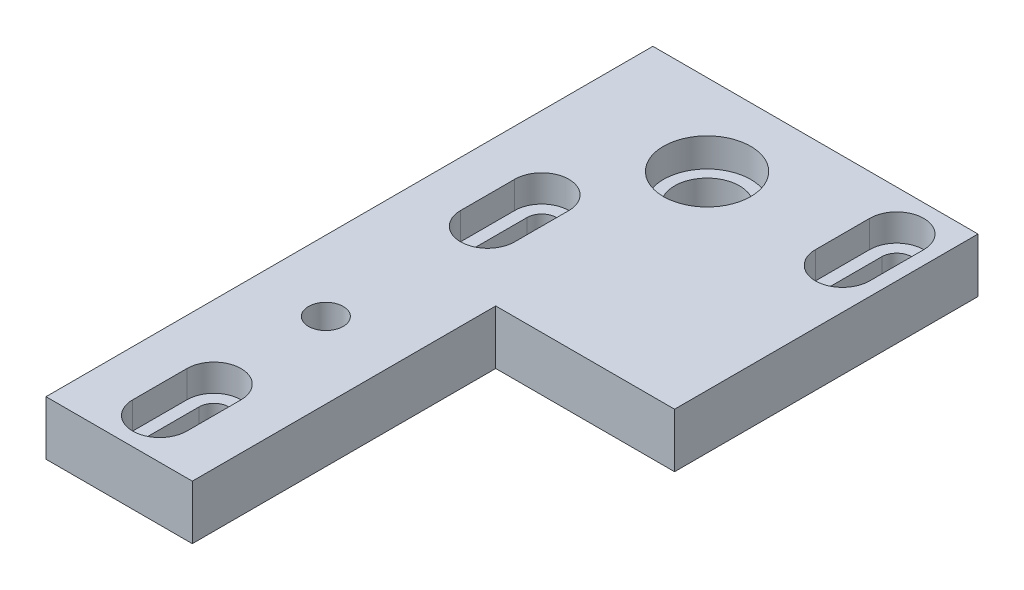
ISO-10303-21;
HEADER;
FILE_DESCRIPTION(('STEP AP214'),'2;1');
FILE_NAME('part.step','',(''),(''),'','','');
FILE_SCHEMA(('AUTOMOTIVE_DESIGN { 1 0 10303 214 1 1 1 1 }'));
ENDSEC;
DATA;
#1=APPLICATION_CONTEXT('core data for automotive mechanical design processes');
#2=APPLICATION_PROTOCOL_DEFINITION('international standard','automotive_design',2000,#1);
#3=PRODUCT_CONTEXT('',#1,'mechanical');
#4=PRODUCT('Part','Part','',(#3));
#5=PRODUCT_RELATED_PRODUCT_CATEGORY('part','',(#4));
#6=PRODUCT_DEFINITION_FORMATION('','',#4);
#7=PRODUCT_DEFINITION_CONTEXT('part definition',#1,'design');
#8=PRODUCT_DEFINITION('design','',#6,#7);
#9=PRODUCT_DEFINITION_SHAPE('','',#8);
#10=(LENGTH_UNIT() NAMED_UNIT(*) SI_UNIT(.MILLI.,.METRE.));
#11=(NAMED_UNIT(*) PLANE_ANGLE_UNIT() SI_UNIT($,.RADIAN.));
#12=(NAMED_UNIT(*) SI_UNIT($,.STERADIAN.) SOLID_ANGLE_UNIT());
#13=UNCERTAINTY_MEASURE_WITH_UNIT(LENGTH_MEASURE(1.E-05),#10,'distance_accuracy_value','');
#14=(GEOMETRIC_REPRESENTATION_CONTEXT(3) GLOBAL_UNCERTAINTY_ASSIGNED_CONTEXT((#13)) GLOBAL_UNIT_ASSIGNED_CONTEXT((#10,
#11,#12)) REPRESENTATION_CONTEXT('',''));
#15=CARTESIAN_POINT('',(0.,0.,0.));
#16=DIRECTION('',(0.,0.,1.));
#17=DIRECTION('',(1.,0.,0.));
#18=AXIS2_PLACEMENT_3D('',#15,#16,#17);
#19=CARTESIAN_POINT('',(0.,10.,0.));
#20=DIRECTION('',(0.,-1.,0.));
#21=DIRECTION('',(0.,0.,-1.));
#22=AXIS2_PLACEMENT_3D('',#19,#20,#21);
#23=PLANE('',#22);
#24=CARTESIAN_POINT('',(-12.,10.,28.35));
#25=DIRECTION('',(0.,1.,0.));
#26=DIRECTION('',(0.,0.,1.));
#27=AXIS2_PLACEMENT_3D('',#24,#25,#26);
#28=CIRCLE('',#27,3.2);
#29=CARTESIAN_POINT('',(-12.,10.,31.55));
#30=VERTEX_POINT('',#29);
#31=EDGE_CURVE('E937',#30,#30,#28,.T.);
#32=ORIENTED_EDGE('',*,*,#31,.F.);
#33=EDGE_LOOP('',(#32));
#34=FACE_BOUND('',#33,.T.);
#35=CARTESIAN_POINT('',(0.,10.,-30.));
#36=DIRECTION('',(0.,1.,0.));
#37=DIRECTION('',(0.,0.,1.));
#38=AXIS2_PLACEMENT_3D('',#35,#36,#37);
#39=CIRCLE('',#38,8.05);
#40=CARTESIAN_POINT('',(0.,10.,-21.95));
#41=VERTEX_POINT('',#40);
#42=EDGE_CURVE('E951',#41,#41,#39,.T.);
#43=ORIENTED_EDGE('',*,*,#42,.F.);
#44=EDGE_LOOP('',(#43));
#45=FACE_BOUND('',#44,.T.);
#46=CARTESIAN_POINT('',(27.5,10.,-27.5));
#47=DIRECTION('',(0.,1.,0.));
#48=DIRECTION('',(0.,0.,1.));
#49=AXIS2_PLACEMENT_3D('',#46,#47,#48);
#50=CIRCLE('',#49,5.);
#51=CARTESIAN_POINT('',(22.5,10.,-27.5));
#52=VERTEX_POINT('',#51);
#53=CARTESIAN_POINT('',(32.5,10.,-27.5));
#54=VERTEX_POINT('',#53);
#55=EDGE_CURVE('E477',#52,#54,#50,.T.);
#56=ORIENTED_EDGE('',*,*,#55,.F.);
#57=DIRECTION('',(0.,0.,-1.));
#58=VECTOR('',#57,1.);
#59=CARTESIAN_POINT('',(22.5,10.,-27.5));
#60=LINE('',#59,#58);
#61=CARTESIAN_POINT('',(22.5,10.,-37.5));
#62=VERTEX_POINT('',#61);
#63=EDGE_CURVE('E498',#52,#62,#60,.T.);
#64=ORIENTED_EDGE('',*,*,#63,.T.);
#65=CARTESIAN_POINT('',(27.5,10.,-37.5));
#66=DIRECTION('',(0.,1.,0.));
#67=DIRECTION('',(0.,0.,1.));
#68=AXIS2_PLACEMENT_3D('',#65,#66,#67);
#69=CIRCLE('',#68,5.);
#70=CARTESIAN_POINT('',(32.5,10.,-37.5));
#71=VERTEX_POINT('',#70);
#72=EDGE_CURVE('E521',#71,#62,#69,.T.);
#73=ORIENTED_EDGE('',*,*,#72,.F.);
#74=DIRECTION('',(0.,0.,-1.));
#75=VECTOR('',#74,1.);
#76=CARTESIAN_POINT('',(32.5,10.,-27.5));
#77=LINE('',#76,#75);
#78=EDGE_CURVE('E485',#54,#71,#77,.T.);
#79=ORIENTED_EDGE('',*,*,#78,.F.);
#80=EDGE_LOOP('',(#56,#64,#73,#79));
#81=FACE_BOUND('',#80,.T.);
#82=DIRECTION('',(0.,0.,-1.));
#83=VECTOR('',#82,1.);
#84=CARTESIAN_POINT('',(35.,10.,-45.));
#85=LINE('',#84,#83);
#86=CARTESIAN_POINT('',(35.,10.,11.));
#87=VERTEX_POINT('',#86);
#88=CARTESIAN_POINT('',(35.,10.,-45.));
#89=VERTEX_POINT('',#88);
#90=EDGE_CURVE('E711',#87,#89,#85,.T.);
#91=ORIENTED_EDGE('',*,*,#90,.T.);
#92=DIRECTION('',(-1.,0.,0.));
#93=VECTOR('',#92,1.);
#94=CARTESIAN_POINT('',(-25.,10.,-45.));
#95=LINE('',#94,#93);
#96=CARTESIAN_POINT('',(-25.,10.,-45.));
#97=VERTEX_POINT('',#96);
#98=EDGE_CURVE('E715',#89,#97,#95,.T.);
#99=ORIENTED_EDGE('',*,*,#98,.T.);
#100=DIRECTION('',(0.,0.,1.));
#101=VECTOR('',#100,1.);
#102=CARTESIAN_POINT('',(-25.,10.,-45.));
#103=LINE('',#102,#101);
#104=CARTESIAN_POINT('',(-25.,10.,67.));
#105=VERTEX_POINT('',#104);
#106=EDGE_CURVE('E719',#97,#105,#103,.T.);
#107=ORIENTED_EDGE('',*,*,#106,.T.);
#108=DIRECTION('',(1.,0.,0.));
#109=VECTOR('',#108,1.);
#110=CARTESIAN_POINT('',(-25.,10.,67.));
#111=LINE('',#110,#109);
#112=CARTESIAN_POINT('',(2.00000000000002,10.,67.));
#113=VERTEX_POINT('',#112);
#114=EDGE_CURVE('E722',#105,#113,#111,.T.);
#115=ORIENTED_EDGE('',*,*,#114,.T.);
#116=DIRECTION('',(0.,0.,-1.));
#117=VECTOR('',#116,1.);
#118=CARTESIAN_POINT('',(2.00000000000002,10.,11.));
#119=LINE('',#118,#117);
#120=CARTESIAN_POINT('',(2.00000000000002,10.,11.));
#121=VERTEX_POINT('',#120);
#122=EDGE_CURVE('E725',#113,#121,#119,.T.);
#123=ORIENTED_EDGE('',*,*,#122,.T.);
#124=DIRECTION('',(1.,0.,0.));
#125=VECTOR('',#124,1.);
#126=CARTESIAN_POINT('',(35.,10.,11.));
#127=LINE('',#126,#125);
#128=EDGE_CURVE('E728',#121,#87,#127,.T.);
#129=ORIENTED_EDGE('',*,*,#128,.T.);
#130=EDGE_LOOP('',(#91,#99,#107,#115,#123,#129));
#131=FACE_BOUND('',#130,.T.);
#132=CARTESIAN_POINT('',(-11.5,10.,59.5));
#133=DIRECTION('',(0.,1.,0.));
#134=DIRECTION('',(0.,0.,1.));
#135=AXIS2_PLACEMENT_3D('',#132,#133,#134);
#136=CIRCLE('',#135,5.);
#137=CARTESIAN_POINT('',(-16.5,10.,59.5));
#138=VERTEX_POINT('',#137);
#139=CARTESIAN_POINT('',(-6.49999999999998,10.,59.5));
#140=VERTEX_POINT('',#139);
#141=EDGE_CURVE('E662',#138,#140,#136,.T.);
#142=ORIENTED_EDGE('',*,*,#141,.F.);
#143=DIRECTION('',(0.,0.,-1.));
#144=VECTOR('',#143,1.);
#145=CARTESIAN_POINT('',(-16.5,10.,59.5));
#146=LINE('',#145,#144);
#147=CARTESIAN_POINT('',(-16.5,10.,49.5));
#148=VERTEX_POINT('',#147);
#149=EDGE_CURVE('E646',#138,#148,#146,.T.);
#150=ORIENTED_EDGE('',*,*,#149,.T.);
#151=CARTESIAN_POINT('',(-11.5,10.,49.5));
#152=DIRECTION('',(0.,1.,0.));
#153=DIRECTION('',(0.,0.,1.));
#154=AXIS2_PLACEMENT_3D('',#151,#152,#153);
#155=CIRCLE('',#154,5.);
#156=CARTESIAN_POINT('',(-6.49999999999999,10.,49.5));
#157=VERTEX_POINT('',#156);
#158=EDGE_CURVE('E691',#157,#148,#155,.T.);
#159=ORIENTED_EDGE('',*,*,#158,.F.);
#160=DIRECTION('',(0.,0.,-1.));
#161=VECTOR('',#160,1.);
#162=CARTESIAN_POINT('',(-6.49999999999999,10.,59.5));
#163=LINE('',#162,#161);
#164=EDGE_CURVE('E624',#140,#157,#163,.T.);
#165=ORIENTED_EDGE('',*,*,#164,.F.);
#166=EDGE_LOOP('',(#142,#150,#159,#165));
#167=FACE_BOUND('',#166,.T.);
#168=DIRECTION('',(0.,0.,-1.));
#169=VECTOR('',#168,1.);
#170=CARTESIAN_POINT('',(-6.49999999999999,10.,-1.));
#171=LINE('',#170,#169);
#172=CARTESIAN_POINT('',(-6.49999999999998,10.,-1.));
#173=VERTEX_POINT('',#172);
#174=CARTESIAN_POINT('',(-6.49999999999999,10.,-11.));
#175=VERTEX_POINT('',#174);
#176=EDGE_CURVE('E539',#173,#175,#171,.T.);
#177=ORIENTED_EDGE('',*,*,#176,.F.);
#178=CARTESIAN_POINT('',(-11.5,10.,-1.));
#179=DIRECTION('',(0.,1.,0.));
#180=DIRECTION('',(0.,0.,1.));
#181=AXIS2_PLACEMENT_3D('',#178,#179,#180);
#182=CIRCLE('',#181,5.);
#183=CARTESIAN_POINT('',(-16.5,10.,-1.));
#184=VERTEX_POINT('',#183);
#185=EDGE_CURVE('E577',#184,#173,#182,.T.);
#186=ORIENTED_EDGE('',*,*,#185,.F.);
#187=DIRECTION('',(0.,0.,-1.));
#188=VECTOR('',#187,1.);
#189=CARTESIAN_POINT('',(-16.5,10.,-1.));
#190=LINE('',#189,#188);
#191=CARTESIAN_POINT('',(-16.5,10.,-11.));
#192=VERTEX_POINT('',#191);
#193=EDGE_CURVE('E561',#184,#192,#190,.T.);
#194=ORIENTED_EDGE('',*,*,#193,.T.);
#195=CARTESIAN_POINT('',(-11.5,10.,-11.));
#196=DIRECTION('',(0.,1.,0.));
#197=DIRECTION('',(0.,0.,1.));
#198=AXIS2_PLACEMENT_3D('',#195,#196,#197);
#199=CIRCLE('',#198,5.);
#200=EDGE_CURVE('E605',#175,#192,#199,.T.);
#201=ORIENTED_EDGE('',*,*,#200,.F.);
#202=EDGE_LOOP('',(#177,#186,#194,#201));
#203=FACE_BOUND('',#202,.T.);
#204=ADVANCED_FACE('F267',(#34,#45,#81,#131,#167,#203),#23,.F.);
#205=CARTESIAN_POINT('',(0.,0.,0.));
#206=DIRECTION('',(0.,-1.,0.));
#207=DIRECTION('',(0.,0.,-1.));
#208=AXIS2_PLACEMENT_3D('',#205,#206,#207);
#209=PLANE('',#208);
#210=CARTESIAN_POINT('',(-12.,0.,28.35));
#211=DIRECTION('',(0.,1.,0.));
#212=DIRECTION('',(0.,0.,1.));
#213=AXIS2_PLACEMENT_3D('',#210,#211,#212);
#214=CIRCLE('',#213,3.2);
#215=CARTESIAN_POINT('',(-12.,0.,31.55));
#216=VERTEX_POINT('',#215);
#217=EDGE_CURVE('E935',#216,#216,#214,.T.);
#218=ORIENTED_EDGE('',*,*,#217,.T.);
#219=EDGE_LOOP('',(#218));
#220=FACE_BOUND('',#219,.T.);
#221=CARTESIAN_POINT('',(0.,0.,-30.));
#222=DIRECTION('',(0.,1.,0.));
#223=DIRECTION('',(0.,0.,1.));
#224=AXIS2_PLACEMENT_3D('',#221,#222,#223);
#225=CIRCLE('',#224,6.);
#226=CARTESIAN_POINT('',(0.,0.,-24.));
#227=VERTEX_POINT('',#226);
#228=EDGE_CURVE('E944',#227,#227,#225,.T.);
#229=ORIENTED_EDGE('',*,*,#228,.T.);
#230=EDGE_LOOP('',(#229));
#231=FACE_BOUND('',#230,.T.);
#232=DIRECTION('',(0.,0.,-1.));
#233=VECTOR('',#232,1.);
#234=CARTESIAN_POINT('',(24.75,0.,-27.5));
#235=LINE('',#234,#233);
#236=CARTESIAN_POINT('',(24.75,0.,-27.5));
#237=VERTEX_POINT('',#236);
#238=CARTESIAN_POINT('',(24.75,0.,-37.5));
#239=VERTEX_POINT('',#238);
#240=EDGE_CURVE('E967',#237,#239,#235,.T.);
#241=ORIENTED_EDGE('',*,*,#240,.F.);
#242=CARTESIAN_POINT('',(27.5,0.,-27.5));
#243=DIRECTION('',(0.,1.,0.));
#244=DIRECTION('',(0.,0.,1.));
#245=AXIS2_PLACEMENT_3D('',#242,#243,#244);
#246=CIRCLE('',#245,2.75);
#247=CARTESIAN_POINT('',(30.25,0.,-27.5));
#248=VERTEX_POINT('',#247);
#249=EDGE_CURVE('E506',#237,#248,#246,.T.);
#250=ORIENTED_EDGE('',*,*,#249,.T.);
#251=DIRECTION('',(0.,0.,-1.));
#252=VECTOR('',#251,1.);
#253=CARTESIAN_POINT('',(30.25,0.,-27.5));
#254=LINE('',#253,#252);
#255=CARTESIAN_POINT('',(30.25,0.,-37.5));
#256=VERTEX_POINT('',#255);
#257=EDGE_CURVE('E963',#248,#256,#254,.T.);
#258=ORIENTED_EDGE('',*,*,#257,.T.);
#259=CARTESIAN_POINT('',(27.5,0.,-37.5));
#260=DIRECTION('',(0.,1.,0.));
#261=DIRECTION('',(0.,0.,1.));
#262=AXIS2_PLACEMENT_3D('',#259,#260,#261);
#263=CIRCLE('',#262,2.75);
#264=EDGE_CURVE('E532',#256,#239,#263,.T.);
#265=ORIENTED_EDGE('',*,*,#264,.T.);
#266=EDGE_LOOP('',(#241,#250,#258,#265));
#267=FACE_BOUND('',#266,.T.);
#268=CARTESIAN_POINT('',(-11.5,0.,49.5));
#269=DIRECTION('',(0.,1.,0.));
#270=DIRECTION('',(0.,0.,1.));
#271=AXIS2_PLACEMENT_3D('',#268,#269,#270);
#272=CIRCLE('',#271,2.75);
#273=CARTESIAN_POINT('',(-8.74999999999999,0.,49.5));
#274=VERTEX_POINT('',#273);
#275=CARTESIAN_POINT('',(-14.25,0.,49.5));
#276=VERTEX_POINT('',#275);
#277=EDGE_CURVE('E703',#274,#276,#272,.T.);
#278=ORIENTED_EDGE('',*,*,#277,.T.);
#279=DIRECTION('',(0.,0.,-1.));
#280=VECTOR('',#279,1.);
#281=CARTESIAN_POINT('',(-14.25,0.,59.5));
#282=LINE('',#281,#280);
#283=CARTESIAN_POINT('',(-14.25,0.,59.5));
#284=VERTEX_POINT('',#283);
#285=EDGE_CURVE('E637',#284,#276,#282,.T.);
#286=ORIENTED_EDGE('',*,*,#285,.F.);
#287=CARTESIAN_POINT('',(-11.5,0.,59.5));
#288=DIRECTION('',(0.,1.,0.));
#289=DIRECTION('',(0.,0.,1.));
#290=AXIS2_PLACEMENT_3D('',#287,#288,#289);
#291=CIRCLE('',#290,2.75);
#292=CARTESIAN_POINT('',(-8.74999999999998,0.,59.5));
#293=VERTEX_POINT('',#292);
#294=EDGE_CURVE('E672',#284,#293,#291,.T.);
#295=ORIENTED_EDGE('',*,*,#294,.T.);
#296=DIRECTION('',(0.,0.,-1.));
#297=VECTOR('',#296,1.);
#298=CARTESIAN_POINT('',(-8.74999999999998,0.,59.5));
#299=LINE('',#298,#297);
#300=EDGE_CURVE('E633',#293,#274,#299,.T.);
#301=ORIENTED_EDGE('',*,*,#300,.T.);
#302=EDGE_LOOP('',(#278,#286,#295,#301));
#303=FACE_BOUND('',#302,.T.);
#304=DIRECTION('',(0.,0.,-1.));
#305=VECTOR('',#304,1.);
#306=CARTESIAN_POINT('',(35.,0.,-45.));
#307=LINE('',#306,#305);
#308=CARTESIAN_POINT('',(35.,0.,11.));
#309=VERTEX_POINT('',#308);
#310=CARTESIAN_POINT('',(35.,0.,-45.));
#311=VERTEX_POINT('',#310);
#312=EDGE_CURVE('E710',#309,#311,#307,.T.);
#313=ORIENTED_EDGE('',*,*,#312,.F.);
#314=DIRECTION('',(1.,0.,0.));
#315=VECTOR('',#314,1.);
#316=CARTESIAN_POINT('',(35.,0.,11.));
#317=LINE('',#316,#315);
#318=CARTESIAN_POINT('',(2.00000000000002,0.,11.));
#319=VERTEX_POINT('',#318);
#320=EDGE_CURVE('E716',#319,#309,#317,.T.);
#321=ORIENTED_EDGE('',*,*,#320,.F.);
#322=DIRECTION('',(0.,0.,-1.));
#323=VECTOR('',#322,1.);
#324=CARTESIAN_POINT('',(2.00000000000002,0.,11.));
#325=LINE('',#324,#323);
#326=CARTESIAN_POINT('',(2.00000000000002,0.,67.));
#327=VERTEX_POINT('',#326);
#328=EDGE_CURVE('E744',#327,#319,#325,.T.);
#329=ORIENTED_EDGE('',*,*,#328,.F.);
#330=DIRECTION('',(1.,0.,0.));
#331=VECTOR('',#330,1.);
#332=CARTESIAN_POINT('',(-25.,0.,67.));
#333=LINE('',#332,#331);
#334=CARTESIAN_POINT('',(-25.,0.,67.));
#335=VERTEX_POINT('',#334);
#336=EDGE_CURVE('E741',#335,#327,#333,.T.);
#337=ORIENTED_EDGE('',*,*,#336,.F.);
#338=DIRECTION('',(0.,0.,1.));
#339=VECTOR('',#338,1.);
#340=CARTESIAN_POINT('',(-25.,0.,-45.));
#341=LINE('',#340,#339);
#342=CARTESIAN_POINT('',(-25.,0.,-45.));
#343=VERTEX_POINT('',#342);
#344=EDGE_CURVE('E738',#343,#335,#341,.T.);
#345=ORIENTED_EDGE('',*,*,#344,.F.);
#346=DIRECTION('',(-1.,0.,0.));
#347=VECTOR('',#346,1.);
#348=CARTESIAN_POINT('',(-25.,0.,-45.));
#349=LINE('',#348,#347);
#350=EDGE_CURVE('E735',#311,#343,#349,.T.);
#351=ORIENTED_EDGE('',*,*,#350,.F.);
#352=EDGE_LOOP('',(#313,#321,#329,#337,#345,#351));
#353=FACE_BOUND('',#352,.T.);
#354=CARTESIAN_POINT('',(-11.5,0.,-1.));
#355=DIRECTION('',(0.,1.,0.));
#356=DIRECTION('',(0.,0.,1.));
#357=AXIS2_PLACEMENT_3D('',#354,#355,#356);
#358=CIRCLE('',#357,2.75);
#359=CARTESIAN_POINT('',(-14.25,0.,-1.));
#360=VERTEX_POINT('',#359);
#361=CARTESIAN_POINT('',(-8.74999999999998,0.,-1.));
#362=VERTEX_POINT('',#361);
#363=EDGE_CURVE('E586',#360,#362,#358,.T.);
#364=ORIENTED_EDGE('',*,*,#363,.T.);
#365=DIRECTION('',(0.,0.,-1.));
#366=VECTOR('',#365,1.);
#367=CARTESIAN_POINT('',(-8.74999999999998,0.,-1.));
#368=LINE('',#367,#366);
#369=CARTESIAN_POINT('',(-8.74999999999999,0.,-11.));
#370=VERTEX_POINT('',#369);
#371=EDGE_CURVE('E548',#362,#370,#368,.T.);
#372=ORIENTED_EDGE('',*,*,#371,.T.);
#373=CARTESIAN_POINT('',(-11.5,0.,-11.));
#374=DIRECTION('',(0.,1.,0.));
#375=DIRECTION('',(0.,0.,1.));
#376=AXIS2_PLACEMENT_3D('',#373,#374,#375);
#377=CIRCLE('',#376,2.75);
#378=CARTESIAN_POINT('',(-14.25,0.,-11.));
#379=VERTEX_POINT('',#378);
#380=EDGE_CURVE('E616',#370,#379,#377,.T.);
#381=ORIENTED_EDGE('',*,*,#380,.T.);
#382=DIRECTION('',(0.,0.,-1.));
#383=VECTOR('',#382,1.);
#384=CARTESIAN_POINT('',(-14.25,0.,-1.));
#385=LINE('',#384,#383);
#386=EDGE_CURVE('E552',#360,#379,#385,.T.);
#387=ORIENTED_EDGE('',*,*,#386,.F.);
#388=EDGE_LOOP('',(#364,#372,#381,#387));
#389=FACE_BOUND('',#388,.T.);
#390=ADVANCED_FACE('F775',(#220,#231,#267,#303,#353,#389),#209,.T.);
#391=CARTESIAN_POINT('',(35.,10.,-45.));
#392=DIRECTION('',(-1.,0.,0.));
#393=DIRECTION('',(0.,0.,1.));
#394=AXIS2_PLACEMENT_3D('',#391,#392,#393);
#395=PLANE('',#394);
#396=ORIENTED_EDGE('',*,*,#312,.T.);
#397=DIRECTION('',(0.,-1.,0.));
#398=VECTOR('',#397,1.);
#399=CARTESIAN_POINT('',(35.,10.,-45.));
#400=LINE('',#399,#398);
#401=EDGE_CURVE('E13',#89,#311,#400,.T.);
#402=ORIENTED_EDGE('',*,*,#401,.F.);
#403=ORIENTED_EDGE('',*,*,#90,.F.);
#404=DIRECTION('',(0.,-1.,0.));
#405=VECTOR('',#404,1.);
#406=CARTESIAN_POINT('',(35.,10.,11.));
#407=LINE('',#406,#405);
#408=EDGE_CURVE('E731',#87,#309,#407,.T.);
#409=ORIENTED_EDGE('',*,*,#408,.T.);
#410=EDGE_LOOP('',(#396,#402,#403,#409));
#411=FACE_BOUND('',#410,.T.);
#412=ADVANCED_FACE('F269',(#411),#395,.F.);
#413=CARTESIAN_POINT('',(-25.,10.,-45.));
#414=DIRECTION('',(0.,0.,1.));
#415=DIRECTION('',(1.,0.,0.));
#416=AXIS2_PLACEMENT_3D('',#413,#414,#415);
#417=PLANE('',#416);
#418=ORIENTED_EDGE('',*,*,#350,.T.);
#419=DIRECTION('',(0.,-1.,0.));
#420=VECTOR('',#419,1.);
#421=CARTESIAN_POINT('',(-25.,10.,-45.));
#422=LINE('',#421,#420);
#423=EDGE_CURVE('E276',#97,#343,#422,.T.);
#424=ORIENTED_EDGE('',*,*,#423,.F.);
#425=ORIENTED_EDGE('',*,*,#98,.F.);
#426=ORIENTED_EDGE('',*,*,#401,.T.);
#427=EDGE_LOOP('',(#418,#424,#425,#426));
#428=FACE_BOUND('',#427,.T.);
#429=ADVANCED_FACE('F793',(#428),#417,.F.);
#430=CARTESIAN_POINT('',(-25.,10.,-45.));
#431=DIRECTION('',(1.,0.,0.));
#432=DIRECTION('',(0.,0.,-1.));
#433=AXIS2_PLACEMENT_3D('',#430,#431,#432);
#434=PLANE('',#433);
#435=ORIENTED_EDGE('',*,*,#344,.T.);
#436=DIRECTION('',(0.,-1.,0.));
#437=VECTOR('',#436,1.);
#438=CARTESIAN_POINT('',(-25.,10.,67.));
#439=LINE('',#438,#437);
#440=EDGE_CURVE('E760',#105,#335,#439,.T.);
#441=ORIENTED_EDGE('',*,*,#440,.F.);
#442=ORIENTED_EDGE('',*,*,#106,.F.);
#443=ORIENTED_EDGE('',*,*,#423,.T.);
#444=EDGE_LOOP('',(#435,#441,#442,#443));
#445=FACE_BOUND('',#444,.T.);
#446=ADVANCED_FACE('F769',(#445),#434,.F.);
#447=CARTESIAN_POINT('',(-25.,10.,67.));
#448=DIRECTION('',(0.,0.,-1.));
#449=DIRECTION('',(-1.,0.,0.));
#450=AXIS2_PLACEMENT_3D('',#447,#448,#449);
#451=PLANE('',#450);
#452=ORIENTED_EDGE('',*,*,#336,.T.);
#453=DIRECTION('',(0.,-1.,0.));
#454=VECTOR('',#453,1.);
#455=CARTESIAN_POINT('',(2.00000000000002,10.,67.));
#456=LINE('',#455,#454);
#457=EDGE_CURVE('E756',#113,#327,#456,.T.);
#458=ORIENTED_EDGE('',*,*,#457,.F.);
#459=ORIENTED_EDGE('',*,*,#114,.F.);
#460=ORIENTED_EDGE('',*,*,#440,.T.);
#461=EDGE_LOOP('',(#452,#458,#459,#460));
#462=FACE_BOUND('',#461,.T.);
#463=ADVANCED_FACE('F781',(#462),#451,.F.);
#464=CARTESIAN_POINT('',(2.00000000000002,10.,11.));
#465=DIRECTION('',(-1.,0.,0.));
#466=DIRECTION('',(0.,0.,1.));
#467=AXIS2_PLACEMENT_3D('',#464,#465,#466);
#468=PLANE('',#467);
#469=ORIENTED_EDGE('',*,*,#328,.T.);
#470=DIRECTION('',(0.,-1.,0.));
#471=VECTOR('',#470,1.);
#472=CARTESIAN_POINT('',(2.00000000000002,10.,11.));
#473=LINE('',#472,#471);
#474=EDGE_CURVE('E752',#121,#319,#473,.T.);
#475=ORIENTED_EDGE('',*,*,#474,.F.);
#476=ORIENTED_EDGE('',*,*,#122,.F.);
#477=ORIENTED_EDGE('',*,*,#457,.T.);
#478=EDGE_LOOP('',(#469,#475,#476,#477));
#479=FACE_BOUND('',#478,.T.);
#480=ADVANCED_FACE('F785',(#479),#468,.F.);
#481=CARTESIAN_POINT('',(35.,10.,11.));
#482=DIRECTION('',(0.,0.,-1.));
#483=DIRECTION('',(-1.,0.,0.));
#484=AXIS2_PLACEMENT_3D('',#481,#482,#483);
#485=PLANE('',#484);
#486=ORIENTED_EDGE('',*,*,#320,.T.);
#487=ORIENTED_EDGE('',*,*,#408,.F.);
#488=ORIENTED_EDGE('',*,*,#128,.F.);
#489=ORIENTED_EDGE('',*,*,#474,.T.);
#490=EDGE_LOOP('',(#486,#487,#488,#489));
#491=FACE_BOUND('',#490,.T.);
#492=ADVANCED_FACE('F796',(#491),#485,.F.);
#493=CARTESIAN_POINT('',(-11.5,10.,49.5));
#494=DIRECTION('',(0.,1.,0.));
#495=DIRECTION('',(0.,0.,1.));
#496=AXIS2_PLACEMENT_3D('',#493,#494,#495);
#497=CYLINDRICAL_SURFACE('',#496,2.75);
#498=ORIENTED_EDGE('',*,*,#277,.F.);
#499=DIRECTION('',(0.,-1.,0.));
#500=VECTOR('',#499,1.);
#501=CARTESIAN_POINT('',(-8.74999999999999,0.,49.5));
#502=LINE('',#501,#500);
#503=CARTESIAN_POINT('',(-8.74999999999998,5.,49.5));
#504=VERTEX_POINT('',#503);
#505=EDGE_CURVE('E687',#504,#274,#502,.T.);
#506=ORIENTED_EDGE('',*,*,#505,.F.);
#507=CARTESIAN_POINT('',(-11.5,5.,49.5));
#508=DIRECTION('',(0.,1.,0.));
#509=DIRECTION('',(0.,0.,1.));
#510=AXIS2_PLACEMENT_3D('',#507,#508,#509);
#511=CIRCLE('',#510,2.75);
#512=CARTESIAN_POINT('',(-14.25,5.,49.5));
#513=VERTEX_POINT('',#512);
#514=EDGE_CURVE('E699',#504,#513,#511,.T.);
#515=ORIENTED_EDGE('',*,*,#514,.T.);
#516=DIRECTION('',(0.,1.,0.));
#517=VECTOR('',#516,1.);
#518=CARTESIAN_POINT('',(-14.25,10.,49.5));
#519=LINE('',#518,#517);
#520=EDGE_CURVE('E679',#276,#513,#519,.T.);
#521=ORIENTED_EDGE('',*,*,#520,.F.);
#522=EDGE_LOOP('',(#498,#506,#515,#521));
#523=FACE_BOUND('',#522,.T.);
#524=ADVANCED_FACE('F798',(#523),#497,.F.);
#525=CARTESIAN_POINT('',(-8.74999999999998,5.,49.5));
#526=DIRECTION('',(0.,-1.,0.));
#527=DIRECTION('',(0.,0.,-1.));
#528=AXIS2_PLACEMENT_3D('',#525,#526,#527);
#529=PLANE('',#528);
#530=DIRECTION('',(0.,0.,-1.));
#531=VECTOR('',#530,1.);
#532=CARTESIAN_POINT('',(-16.5,5.,59.5));
#533=LINE('',#532,#531);
#534=CARTESIAN_POINT('',(-16.5,5.,59.5));
#535=VERTEX_POINT('',#534);
#536=CARTESIAN_POINT('',(-16.5,5.,49.5));
#537=VERTEX_POINT('',#536);
#538=EDGE_CURVE('E643',#535,#537,#533,.T.);
#539=ORIENTED_EDGE('',*,*,#538,.F.);
#540=CARTESIAN_POINT('',(-11.5,5.,59.5));
#541=DIRECTION('',(0.,1.,0.));
#542=DIRECTION('',(0.,0.,1.));
#543=AXIS2_PLACEMENT_3D('',#540,#541,#542);
#544=CIRCLE('',#543,5.);
#545=CARTESIAN_POINT('',(-6.49999999999998,5.,59.5));
#546=VERTEX_POINT('',#545);
#547=EDGE_CURVE('E666',#535,#546,#544,.T.);
#548=ORIENTED_EDGE('',*,*,#547,.T.);
#549=DIRECTION('',(0.,0.,-1.));
#550=VECTOR('',#549,1.);
#551=CARTESIAN_POINT('',(-6.49999999999998,5.,59.5));
#552=LINE('',#551,#550);
#553=CARTESIAN_POINT('',(-6.49999999999998,5.,49.5));
#554=VERTEX_POINT('',#553);
#555=EDGE_CURVE('E627',#546,#554,#552,.T.);
#556=ORIENTED_EDGE('',*,*,#555,.T.);
#557=CARTESIAN_POINT('',(-11.5,5.,49.5));
#558=DIRECTION('',(0.,1.,0.));
#559=DIRECTION('',(0.,0.,1.));
#560=AXIS2_PLACEMENT_3D('',#557,#558,#559);
#561=CIRCLE('',#560,5.);
#562=EDGE_CURVE('E695',#554,#537,#561,.T.);
#563=ORIENTED_EDGE('',*,*,#562,.T.);
#564=EDGE_LOOP('',(#539,#548,#556,#563));
#565=FACE_BOUND('',#564,.T.);
#566=ORIENTED_EDGE('',*,*,#514,.F.);
#567=DIRECTION('',(0.,0.,-1.));
#568=VECTOR('',#567,1.);
#569=CARTESIAN_POINT('',(-8.74999999999998,5.,59.5));
#570=LINE('',#569,#568);
#571=CARTESIAN_POINT('',(-8.74999999999998,5.,59.5));
#572=VERTEX_POINT('',#571);
#573=EDGE_CURVE('E630',#572,#504,#570,.T.);
#574=ORIENTED_EDGE('',*,*,#573,.F.);
#575=CARTESIAN_POINT('',(-11.5,5.,59.5));
#576=DIRECTION('',(0.,1.,0.));
#577=DIRECTION('',(0.,0.,1.));
#578=AXIS2_PLACEMENT_3D('',#575,#576,#577);
#579=CIRCLE('',#578,2.75);
#580=CARTESIAN_POINT('',(-14.25,5.,59.5));
#581=VERTEX_POINT('',#580);
#582=EDGE_CURVE('E669',#581,#572,#579,.T.);
#583=ORIENTED_EDGE('',*,*,#582,.F.);
#584=DIRECTION('',(0.,0.,-1.));
#585=VECTOR('',#584,1.);
#586=CARTESIAN_POINT('',(-14.25,5.,59.5));
#587=LINE('',#586,#585);
#588=EDGE_CURVE('E640',#581,#513,#587,.T.);
#589=ORIENTED_EDGE('',*,*,#588,.T.);
#590=EDGE_LOOP('',(#566,#574,#583,#589));
#591=FACE_BOUND('',#590,.T.);
#592=ADVANCED_FACE('F804',(#565,#591),#529,.F.);
#593=CARTESIAN_POINT('',(-11.5,10.,49.5));
#594=DIRECTION('',(0.,1.,0.));
#595=DIRECTION('',(0.,0.,1.));
#596=AXIS2_PLACEMENT_3D('',#593,#594,#595);
#597=CYLINDRICAL_SURFACE('',#596,5.);
#598=ORIENTED_EDGE('',*,*,#562,.F.);
#599=DIRECTION('',(0.,-1.,0.));
#600=VECTOR('',#599,1.);
#601=CARTESIAN_POINT('',(-6.49999999999998,5.,49.5));
#602=LINE('',#601,#600);
#603=EDGE_CURVE('E683',#157,#554,#602,.T.);
#604=ORIENTED_EDGE('',*,*,#603,.F.);
#605=ORIENTED_EDGE('',*,*,#158,.T.);
#606=DIRECTION('',(0.,1.,0.));
#607=VECTOR('',#606,1.);
#608=CARTESIAN_POINT('',(-16.5,10.,49.5));
#609=LINE('',#608,#607);
#610=EDGE_CURVE('E707',#537,#148,#609,.T.);
#611=ORIENTED_EDGE('',*,*,#610,.F.);
#612=EDGE_LOOP('',(#598,#604,#605,#611));
#613=FACE_BOUND('',#612,.T.);
#614=ADVANCED_FACE('F822',(#613),#597,.F.);
#615=CARTESIAN_POINT('',(-11.5,10.,59.5));
#616=DIRECTION('',(0.,1.,0.));
#617=DIRECTION('',(0.,0.,1.));
#618=AXIS2_PLACEMENT_3D('',#615,#616,#617);
#619=CYLINDRICAL_SURFACE('',#618,2.75);
#620=ORIENTED_EDGE('',*,*,#582,.T.);
#621=DIRECTION('',(0.,-1.,0.));
#622=VECTOR('',#621,1.);
#623=CARTESIAN_POINT('',(-8.74999999999998,0.,59.5));
#624=LINE('',#623,#622);
#625=EDGE_CURVE('E658',#572,#293,#624,.T.);
#626=ORIENTED_EDGE('',*,*,#625,.T.);
#627=ORIENTED_EDGE('',*,*,#294,.F.);
#628=DIRECTION('',(0.,1.,0.));
#629=VECTOR('',#628,1.);
#630=CARTESIAN_POINT('',(-14.25,10.,59.5));
#631=LINE('',#630,#629);
#632=EDGE_CURVE('E650',#581,#284,#631,.F.);
#633=ORIENTED_EDGE('',*,*,#632,.F.);
#634=EDGE_LOOP('',(#620,#626,#627,#633));
#635=FACE_BOUND('',#634,.T.);
#636=ADVANCED_FACE('F826',(#635),#619,.F.);
#637=CARTESIAN_POINT('',(-11.5,10.,59.5));
#638=DIRECTION('',(0.,1.,0.));
#639=DIRECTION('',(0.,0.,1.));
#640=AXIS2_PLACEMENT_3D('',#637,#638,#639);
#641=CYLINDRICAL_SURFACE('',#640,5.);
#642=ORIENTED_EDGE('',*,*,#141,.T.);
#643=DIRECTION('',(0.,-1.,0.));
#644=VECTOR('',#643,1.);
#645=CARTESIAN_POINT('',(-6.49999999999998,5.,59.5));
#646=LINE('',#645,#644);
#647=EDGE_CURVE('E654',#140,#546,#646,.T.);
#648=ORIENTED_EDGE('',*,*,#647,.T.);
#649=ORIENTED_EDGE('',*,*,#547,.F.);
#650=DIRECTION('',(0.,1.,0.));
#651=VECTOR('',#650,1.);
#652=CARTESIAN_POINT('',(-16.5,10.,59.5));
#653=LINE('',#652,#651);
#654=EDGE_CURVE('E676',#138,#535,#653,.F.);
#655=ORIENTED_EDGE('',*,*,#654,.F.);
#656=EDGE_LOOP('',(#642,#648,#649,#655));
#657=FACE_BOUND('',#656,.T.);
#658=ADVANCED_FACE('F830',(#657),#641,.F.);
#659=CARTESIAN_POINT('',(-16.5,10.,59.5));
#660=DIRECTION('',(-1.,0.,0.));
#661=DIRECTION('',(0.,0.,1.));
#662=AXIS2_PLACEMENT_3D('',#659,#660,#661);
#663=PLANE('',#662);
#664=ORIENTED_EDGE('',*,*,#610,.T.);
#665=ORIENTED_EDGE('',*,*,#149,.F.);
#666=ORIENTED_EDGE('',*,*,#654,.T.);
#667=ORIENTED_EDGE('',*,*,#538,.T.);
#668=EDGE_LOOP('',(#664,#665,#666,#667));
#669=FACE_BOUND('',#668,.T.);
#670=ADVANCED_FACE('F834',(#669),#663,.F.);
#671=CARTESIAN_POINT('',(-14.25,10.,59.5));
#672=DIRECTION('',(-1.,0.,0.));
#673=DIRECTION('',(0.,0.,1.));
#674=AXIS2_PLACEMENT_3D('',#671,#672,#673);
#675=PLANE('',#674);
#676=ORIENTED_EDGE('',*,*,#520,.T.);
#677=ORIENTED_EDGE('',*,*,#588,.F.);
#678=ORIENTED_EDGE('',*,*,#632,.T.);
#679=ORIENTED_EDGE('',*,*,#285,.T.);
#680=EDGE_LOOP('',(#676,#677,#678,#679));
#681=FACE_BOUND('',#680,.T.);
#682=ADVANCED_FACE('F838',(#681),#675,.F.);
#683=CARTESIAN_POINT('',(-8.74999999999998,0.,59.5));
#684=DIRECTION('',(1.,0.,0.));
#685=DIRECTION('',(0.,0.,-1.));
#686=AXIS2_PLACEMENT_3D('',#683,#684,#685);
#687=PLANE('',#686);
#688=ORIENTED_EDGE('',*,*,#505,.T.);
#689=ORIENTED_EDGE('',*,*,#300,.F.);
#690=ORIENTED_EDGE('',*,*,#625,.F.);
#691=ORIENTED_EDGE('',*,*,#573,.T.);
#692=EDGE_LOOP('',(#688,#689,#690,#691));
#693=FACE_BOUND('',#692,.T.);
#694=ADVANCED_FACE('F842',(#693),#687,.F.);
#695=CARTESIAN_POINT('',(-6.49999999999998,5.,59.5));
#696=DIRECTION('',(1.,0.,0.));
#697=DIRECTION('',(0.,0.,-1.));
#698=AXIS2_PLACEMENT_3D('',#695,#696,#697);
#699=PLANE('',#698);
#700=ORIENTED_EDGE('',*,*,#603,.T.);
#701=ORIENTED_EDGE('',*,*,#555,.F.);
#702=ORIENTED_EDGE('',*,*,#647,.F.);
#703=ORIENTED_EDGE('',*,*,#164,.T.);
#704=EDGE_LOOP('',(#700,#701,#702,#703));
#705=FACE_BOUND('',#704,.T.);
#706=ADVANCED_FACE('F846',(#705),#699,.F.);
#707=CARTESIAN_POINT('',(-11.5,10.,-11.));
#708=DIRECTION('',(0.,1.,0.));
#709=DIRECTION('',(0.,0.,1.));
#710=AXIS2_PLACEMENT_3D('',#707,#708,#709);
#711=CYLINDRICAL_SURFACE('',#710,2.75);
#712=ORIENTED_EDGE('',*,*,#380,.F.);
#713=DIRECTION('',(0.,-1.,0.));
#714=VECTOR('',#713,1.);
#715=CARTESIAN_POINT('',(-8.74999999999999,0.,-11.));
#716=LINE('',#715,#714);
#717=CARTESIAN_POINT('',(-8.74999999999998,5.,-11.));
#718=VERTEX_POINT('',#717);
#719=EDGE_CURVE('E601',#718,#370,#716,.T.);
#720=ORIENTED_EDGE('',*,*,#719,.F.);
#721=CARTESIAN_POINT('',(-11.5,5.,-11.));
#722=DIRECTION('',(0.,1.,0.));
#723=DIRECTION('',(0.,0.,1.));
#724=AXIS2_PLACEMENT_3D('',#721,#722,#723);
#725=CIRCLE('',#724,2.75);
#726=CARTESIAN_POINT('',(-14.25,5.,-11.));
#727=VERTEX_POINT('',#726);
#728=EDGE_CURVE('E612',#718,#727,#725,.T.);
#729=ORIENTED_EDGE('',*,*,#728,.T.);
#730=DIRECTION('',(0.,1.,0.));
#731=VECTOR('',#730,1.);
#732=CARTESIAN_POINT('',(-14.25,10.,-11.));
#733=LINE('',#732,#731);
#734=EDGE_CURVE('E593',#379,#727,#733,.T.);
#735=ORIENTED_EDGE('',*,*,#734,.F.);
#736=EDGE_LOOP('',(#712,#720,#729,#735));
#737=FACE_BOUND('',#736,.T.);
#738=ADVANCED_FACE('F850',(#737),#711,.F.);
#739=CARTESIAN_POINT('',(-8.74999999999998,5.,-11.));
#740=DIRECTION('',(0.,-1.,0.));
#741=DIRECTION('',(0.,0.,-1.));
#742=AXIS2_PLACEMENT_3D('',#739,#740,#741);
#743=PLANE('',#742);
#744=DIRECTION('',(0.,0.,-1.));
#745=VECTOR('',#744,1.);
#746=CARTESIAN_POINT('',(-16.5,5.,-1.));
#747=LINE('',#746,#745);
#748=CARTESIAN_POINT('',(-16.5,5.,-1.));
#749=VERTEX_POINT('',#748);
#750=CARTESIAN_POINT('',(-16.5,5.,-11.));
#751=VERTEX_POINT('',#750);
#752=EDGE_CURVE('E558',#749,#751,#747,.T.);
#753=ORIENTED_EDGE('',*,*,#752,.F.);
#754=CARTESIAN_POINT('',(-11.5,5.,-1.));
#755=DIRECTION('',(0.,1.,0.));
#756=DIRECTION('',(0.,0.,1.));
#757=AXIS2_PLACEMENT_3D('',#754,#755,#756);
#758=CIRCLE('',#757,5.);
#759=CARTESIAN_POINT('',(-6.49999999999998,5.,-1.));
#760=VERTEX_POINT('',#759);
#761=EDGE_CURVE('E580',#749,#760,#758,.T.);
#762=ORIENTED_EDGE('',*,*,#761,.T.);
#763=DIRECTION('',(0.,0.,-1.));
#764=VECTOR('',#763,1.);
#765=CARTESIAN_POINT('',(-6.49999999999998,5.,-1.));
#766=LINE('',#765,#764);
#767=CARTESIAN_POINT('',(-6.49999999999998,5.,-11.));
#768=VERTEX_POINT('',#767);
#769=EDGE_CURVE('E542',#760,#768,#766,.T.);
#770=ORIENTED_EDGE('',*,*,#769,.T.);
#771=CARTESIAN_POINT('',(-11.5,5.,-11.));
#772=DIRECTION('',(0.,1.,0.));
#773=DIRECTION('',(0.,0.,1.));
#774=AXIS2_PLACEMENT_3D('',#771,#772,#773);
#775=CIRCLE('',#774,5.);
#776=EDGE_CURVE('E608',#768,#751,#775,.T.);
#777=ORIENTED_EDGE('',*,*,#776,.T.);
#778=EDGE_LOOP('',(#753,#762,#770,#777));
#779=FACE_BOUND('',#778,.T.);
#780=ORIENTED_EDGE('',*,*,#728,.F.);
#781=DIRECTION('',(0.,0.,-1.));
#782=VECTOR('',#781,1.);
#783=CARTESIAN_POINT('',(-8.74999999999998,5.,-1.));
#784=LINE('',#783,#782);
#785=CARTESIAN_POINT('',(-8.74999999999998,5.,-1.));
#786=VERTEX_POINT('',#785);
#787=EDGE_CURVE('E545',#786,#718,#784,.T.);
#788=ORIENTED_EDGE('',*,*,#787,.F.);
#789=CARTESIAN_POINT('',(-11.5,5.,-1.));
#790=DIRECTION('',(0.,1.,0.));
#791=DIRECTION('',(0.,0.,1.));
#792=AXIS2_PLACEMENT_3D('',#789,#790,#791);
#793=CIRCLE('',#792,2.75);
#794=CARTESIAN_POINT('',(-14.25,5.,-1.));
#795=VERTEX_POINT('',#794);
#796=EDGE_CURVE('E583',#795,#786,#793,.T.);
#797=ORIENTED_EDGE('',*,*,#796,.F.);
#798=DIRECTION('',(0.,0.,-1.));
#799=VECTOR('',#798,1.);
#800=CARTESIAN_POINT('',(-14.25,5.,-1.));
#801=LINE('',#800,#799);
#802=EDGE_CURVE('E555',#795,#727,#801,.T.);
#803=ORIENTED_EDGE('',*,*,#802,.T.);
#804=EDGE_LOOP('',(#780,#788,#797,#803));
#805=FACE_BOUND('',#804,.T.);
#806=ADVANCED_FACE('F854',(#779,#805),#743,.F.);
#807=CARTESIAN_POINT('',(-11.5,10.,-11.));
#808=DIRECTION('',(0.,1.,0.));
#809=DIRECTION('',(0.,0.,1.));
#810=AXIS2_PLACEMENT_3D('',#807,#808,#809);
#811=CYLINDRICAL_SURFACE('',#810,5.);
#812=ORIENTED_EDGE('',*,*,#776,.F.);
#813=DIRECTION('',(0.,-1.,0.));
#814=VECTOR('',#813,1.);
#815=CARTESIAN_POINT('',(-6.49999999999998,5.,-11.));
#816=LINE('',#815,#814);
#817=EDGE_CURVE('E597',#175,#768,#816,.T.);
#818=ORIENTED_EDGE('',*,*,#817,.F.);
#819=ORIENTED_EDGE('',*,*,#200,.T.);
#820=DIRECTION('',(0.,1.,0.));
#821=VECTOR('',#820,1.);
#822=CARTESIAN_POINT('',(-16.5,10.,-11.));
#823=LINE('',#822,#821);
#824=EDGE_CURVE('E620',#751,#192,#823,.T.);
#825=ORIENTED_EDGE('',*,*,#824,.F.);
#826=EDGE_LOOP('',(#812,#818,#819,#825));
#827=FACE_BOUND('',#826,.T.);
#828=ADVANCED_FACE('F858',(#827),#811,.F.);
#829=CARTESIAN_POINT('',(-11.5,10.,-1.));
#830=DIRECTION('',(0.,1.,0.));
#831=DIRECTION('',(0.,0.,1.));
#832=AXIS2_PLACEMENT_3D('',#829,#830,#831);
#833=CYLINDRICAL_SURFACE('',#832,2.75);
#834=ORIENTED_EDGE('',*,*,#796,.T.);
#835=DIRECTION('',(0.,-1.,0.));
#836=VECTOR('',#835,1.);
#837=CARTESIAN_POINT('',(-8.74999999999998,0.,-1.));
#838=LINE('',#837,#836);
#839=EDGE_CURVE('E573',#786,#362,#838,.T.);
#840=ORIENTED_EDGE('',*,*,#839,.T.);
#841=ORIENTED_EDGE('',*,*,#363,.F.);
#842=DIRECTION('',(0.,1.,0.));
#843=VECTOR('',#842,1.);
#844=CARTESIAN_POINT('',(-14.25,10.,-1.));
#845=LINE('',#844,#843);
#846=EDGE_CURVE('E565',#795,#360,#845,.F.);
#847=ORIENTED_EDGE('',*,*,#846,.F.);
#848=EDGE_LOOP('',(#834,#840,#841,#847));
#849=FACE_BOUND('',#848,.T.);
#850=ADVANCED_FACE('F862',(#849),#833,.F.);
#851=CARTESIAN_POINT('',(-11.5,10.,-1.));
#852=DIRECTION('',(0.,1.,0.));
#853=DIRECTION('',(0.,0.,1.));
#854=AXIS2_PLACEMENT_3D('',#851,#852,#853);
#855=CYLINDRICAL_SURFACE('',#854,5.);
#856=ORIENTED_EDGE('',*,*,#185,.T.);
#857=DIRECTION('',(0.,-1.,0.));
#858=VECTOR('',#857,1.);
#859=CARTESIAN_POINT('',(-6.49999999999998,5.,-1.));
#860=LINE('',#859,#858);
#861=EDGE_CURVE('E569',#173,#760,#860,.T.);
#862=ORIENTED_EDGE('',*,*,#861,.T.);
#863=ORIENTED_EDGE('',*,*,#761,.F.);
#864=DIRECTION('',(0.,1.,0.));
#865=VECTOR('',#864,1.);
#866=CARTESIAN_POINT('',(-16.5,10.,-1.));
#867=LINE('',#866,#865);
#868=EDGE_CURVE('E590',#184,#749,#867,.F.);
#869=ORIENTED_EDGE('',*,*,#868,.F.);
#870=EDGE_LOOP('',(#856,#862,#863,#869));
#871=FACE_BOUND('',#870,.T.);
#872=ADVANCED_FACE('F866',(#871),#855,.F.);
#873=CARTESIAN_POINT('',(-16.5,10.,-1.));
#874=DIRECTION('',(-1.,0.,0.));
#875=DIRECTION('',(0.,0.,1.));
#876=AXIS2_PLACEMENT_3D('',#873,#874,#875);
#877=PLANE('',#876);
#878=ORIENTED_EDGE('',*,*,#824,.T.);
#879=ORIENTED_EDGE('',*,*,#193,.F.);
#880=ORIENTED_EDGE('',*,*,#868,.T.);
#881=ORIENTED_EDGE('',*,*,#752,.T.);
#882=EDGE_LOOP('',(#878,#879,#880,#881));
#883=FACE_BOUND('',#882,.T.);
#884=ADVANCED_FACE('F870',(#883),#877,.F.);
#885=CARTESIAN_POINT('',(-14.25,10.,-1.));
#886=DIRECTION('',(-1.,0.,0.));
#887=DIRECTION('',(0.,0.,1.));
#888=AXIS2_PLACEMENT_3D('',#885,#886,#887);
#889=PLANE('',#888);
#890=ORIENTED_EDGE('',*,*,#734,.T.);
#891=ORIENTED_EDGE('',*,*,#802,.F.);
#892=ORIENTED_EDGE('',*,*,#846,.T.);
#893=ORIENTED_EDGE('',*,*,#386,.T.);
#894=EDGE_LOOP('',(#890,#891,#892,#893));
#895=FACE_BOUND('',#894,.T.);
#896=ADVANCED_FACE('F874',(#895),#889,.F.);
#897=CARTESIAN_POINT('',(-8.74999999999998,0.,-1.));
#898=DIRECTION('',(1.,0.,0.));
#899=DIRECTION('',(0.,0.,-1.));
#900=AXIS2_PLACEMENT_3D('',#897,#898,#899);
#901=PLANE('',#900);
#902=ORIENTED_EDGE('',*,*,#719,.T.);
#903=ORIENTED_EDGE('',*,*,#371,.F.);
#904=ORIENTED_EDGE('',*,*,#839,.F.);
#905=ORIENTED_EDGE('',*,*,#787,.T.);
#906=EDGE_LOOP('',(#902,#903,#904,#905));
#907=FACE_BOUND('',#906,.T.);
#908=ADVANCED_FACE('F878',(#907),#901,.F.);
#909=CARTESIAN_POINT('',(-6.49999999999998,5.,-1.));
#910=DIRECTION('',(1.,0.,0.));
#911=DIRECTION('',(0.,0.,-1.));
#912=AXIS2_PLACEMENT_3D('',#909,#910,#911);
#913=PLANE('',#912);
#914=ORIENTED_EDGE('',*,*,#817,.T.);
#915=ORIENTED_EDGE('',*,*,#769,.F.);
#916=ORIENTED_EDGE('',*,*,#861,.F.);
#917=ORIENTED_EDGE('',*,*,#176,.T.);
#918=EDGE_LOOP('',(#914,#915,#916,#917));
#919=FACE_BOUND('',#918,.T.);
#920=ADVANCED_FACE('F882',(#919),#913,.F.);
#921=CARTESIAN_POINT('',(27.5,10.,-37.5));
#922=DIRECTION('',(0.,1.,0.));
#923=DIRECTION('',(0.,0.,1.));
#924=AXIS2_PLACEMENT_3D('',#921,#922,#923);
#925=CYLINDRICAL_SURFACE('',#924,2.75);
#926=ORIENTED_EDGE('',*,*,#264,.F.);
#927=DIRECTION('',(0.,-1.,0.));
#928=VECTOR('',#927,1.);
#929=CARTESIAN_POINT('',(30.25,0.,-37.5));
#930=LINE('',#929,#928);
#931=CARTESIAN_POINT('',(30.25,5.,-37.5));
#932=VERTEX_POINT('',#931);
#933=EDGE_CURVE('E291',#932,#256,#930,.T.);
#934=ORIENTED_EDGE('',*,*,#933,.F.);
#935=CARTESIAN_POINT('',(27.5,5.,-37.5));
#936=DIRECTION('',(0.,1.,0.));
#937=DIRECTION('',(0.,0.,1.));
#938=AXIS2_PLACEMENT_3D('',#935,#936,#937);
#939=CIRCLE('',#938,2.75);
#940=CARTESIAN_POINT('',(24.75,5.,-37.5));
#941=VERTEX_POINT('',#940);
#942=EDGE_CURVE('E528',#932,#941,#939,.T.);
#943=ORIENTED_EDGE('',*,*,#942,.T.);
#944=DIRECTION('',(0.,1.,0.));
#945=VECTOR('',#944,1.);
#946=CARTESIAN_POINT('',(24.75,10.,-37.5));
#947=LINE('',#946,#945);
#948=EDGE_CURVE('E513',#239,#941,#947,.T.);
#949=ORIENTED_EDGE('',*,*,#948,.F.);
#950=EDGE_LOOP('',(#926,#934,#943,#949));
#951=FACE_BOUND('',#950,.T.);
#952=ADVANCED_FACE('F886',(#951),#925,.F.);
#953=CARTESIAN_POINT('',(30.25,5.,-37.5));
#954=DIRECTION('',(0.,-1.,0.));
#955=DIRECTION('',(0.,0.,-1.));
#956=AXIS2_PLACEMENT_3D('',#953,#954,#955);
#957=PLANE('',#956);
#958=DIRECTION('',(0.,0.,-1.));
#959=VECTOR('',#958,1.);
#960=CARTESIAN_POINT('',(22.5,5.,-27.5));
#961=LINE('',#960,#959);
#962=CARTESIAN_POINT('',(22.5,5.,-27.5));
#963=VERTEX_POINT('',#962);
#964=CARTESIAN_POINT('',(22.5,5.,-37.5));
#965=VERTEX_POINT('',#964);
#966=EDGE_CURVE('E472',#963,#965,#961,.T.);
#967=ORIENTED_EDGE('',*,*,#966,.F.);
#968=CARTESIAN_POINT('',(27.5,5.,-27.5));
#969=DIRECTION('',(0.,1.,0.));
#970=DIRECTION('',(0.,0.,1.));
#971=AXIS2_PLACEMENT_3D('',#968,#969,#970);
#972=CIRCLE('',#971,5.);
#973=CARTESIAN_POINT('',(32.5,5.,-27.5));
#974=VERTEX_POINT('',#973);
#975=EDGE_CURVE('E466',#963,#974,#972,.T.);
#976=ORIENTED_EDGE('',*,*,#975,.T.);
#977=DIRECTION('',(0.,0.,-1.));
#978=VECTOR('',#977,1.);
#979=CARTESIAN_POINT('',(32.5,5.,-27.5));
#980=LINE('',#979,#978);
#981=CARTESIAN_POINT('',(32.5,5.,-37.5));
#982=VERTEX_POINT('',#981);
#983=EDGE_CURVE('E470',#974,#982,#980,.T.);
#984=ORIENTED_EDGE('',*,*,#983,.T.);
#985=CARTESIAN_POINT('',(27.5,5.,-37.5));
#986=DIRECTION('',(0.,1.,0.));
#987=DIRECTION('',(0.,0.,1.));
#988=AXIS2_PLACEMENT_3D('',#985,#986,#987);
#989=CIRCLE('',#988,5.);
#990=EDGE_CURVE('E525',#982,#965,#989,.T.);
#991=ORIENTED_EDGE('',*,*,#990,.T.);
#992=EDGE_LOOP('',(#967,#976,#984,#991));
#993=FACE_BOUND('',#992,.T.);
#994=ORIENTED_EDGE('',*,*,#942,.F.);
#995=DIRECTION('',(0.,0.,-1.));
#996=VECTOR('',#995,1.);
#997=CARTESIAN_POINT('',(30.25,5.,-27.5));
#998=LINE('',#997,#996);
#999=CARTESIAN_POINT('',(30.25,5.,-27.5));
#1000=VERTEX_POINT('',#999);
#1001=EDGE_CURVE('E484',#1000,#932,#998,.T.);
#1002=ORIENTED_EDGE('',*,*,#1001,.F.);
#1003=CARTESIAN_POINT('',(27.5,5.,-27.5));
#1004=DIRECTION('',(0.,1.,0.));
#1005=DIRECTION('',(0.,0.,1.));
#1006=AXIS2_PLACEMENT_3D('',#1003,#1004,#1005);
#1007=CIRCLE('',#1006,2.75);
#1008=CARTESIAN_POINT('',(24.75,5.,-27.5));
#1009=VERTEX_POINT('',#1008);
#1010=EDGE_CURVE('E476',#1009,#1000,#1007,.T.);
#1011=ORIENTED_EDGE('',*,*,#1010,.F.);
#1012=DIRECTION('',(0.,0.,-1.));
#1013=VECTOR('',#1012,1.);
#1014=CARTESIAN_POINT('',(24.75,5.,-27.5));
#1015=LINE('',#1014,#1013);
#1016=EDGE_CURVE('E970',#1009,#941,#1015,.T.);
#1017=ORIENTED_EDGE('',*,*,#1016,.T.);
#1018=EDGE_LOOP('',(#994,#1002,#1011,#1017));
#1019=FACE_BOUND('',#1018,.T.);
#1020=ADVANCED_FACE('F467',(#993,#1019),#957,.F.);
#1021=CARTESIAN_POINT('',(27.5,10.,-37.5));
#1022=DIRECTION('',(0.,1.,0.));
#1023=DIRECTION('',(0.,0.,1.));
#1024=AXIS2_PLACEMENT_3D('',#1021,#1022,#1023);
#1025=CYLINDRICAL_SURFACE('',#1024,5.);
#1026=ORIENTED_EDGE('',*,*,#990,.F.);
#1027=DIRECTION('',(0.,-1.,0.));
#1028=VECTOR('',#1027,1.);
#1029=CARTESIAN_POINT('',(32.5,5.,-37.5));
#1030=LINE('',#1029,#1028);
#1031=EDGE_CURVE('E482',#71,#982,#1030,.T.);
#1032=ORIENTED_EDGE('',*,*,#1031,.F.);
#1033=ORIENTED_EDGE('',*,*,#72,.T.);
#1034=DIRECTION('',(0.,1.,0.));
#1035=VECTOR('',#1034,1.);
#1036=CARTESIAN_POINT('',(22.5,10.,-37.5));
#1037=LINE('',#1036,#1035);
#1038=EDGE_CURVE('E536',#965,#62,#1037,.T.);
#1039=ORIENTED_EDGE('',*,*,#1038,.F.);
#1040=EDGE_LOOP('',(#1026,#1032,#1033,#1039));
#1041=FACE_BOUND('',#1040,.T.);
#1042=ADVANCED_FACE('F893',(#1041),#1025,.F.);
#1043=CARTESIAN_POINT('',(27.5,10.,-27.5));
#1044=DIRECTION('',(0.,1.,0.));
#1045=DIRECTION('',(0.,0.,1.));
#1046=AXIS2_PLACEMENT_3D('',#1043,#1044,#1045);
#1047=CYLINDRICAL_SURFACE('',#1046,2.75);
#1048=ORIENTED_EDGE('',*,*,#1010,.T.);
#1049=DIRECTION('',(0.,-1.,0.));
#1050=VECTOR('',#1049,1.);
#1051=CARTESIAN_POINT('',(30.25,0.,-27.5));
#1052=LINE('',#1051,#1050);
#1053=EDGE_CURVE('E491',#1000,#248,#1052,.T.);
#1054=ORIENTED_EDGE('',*,*,#1053,.T.);
#1055=ORIENTED_EDGE('',*,*,#249,.F.);
#1056=DIRECTION('',(0.,1.,0.));
#1057=VECTOR('',#1056,1.);
#1058=CARTESIAN_POINT('',(24.75,10.,-27.5));
#1059=LINE('',#1058,#1057);
#1060=EDGE_CURVE('E492',#1009,#237,#1059,.F.);
#1061=ORIENTED_EDGE('',*,*,#1060,.F.);
#1062=EDGE_LOOP('',(#1048,#1054,#1055,#1061));
#1063=FACE_BOUND('',#1062,.T.);
#1064=ADVANCED_FACE('F896',(#1063),#1047,.F.);
#1065=CARTESIAN_POINT('',(27.5,10.,-27.5));
#1066=DIRECTION('',(0.,1.,0.));
#1067=DIRECTION('',(0.,0.,1.));
#1068=AXIS2_PLACEMENT_3D('',#1065,#1066,#1067);
#1069=CYLINDRICAL_SURFACE('',#1068,5.);
#1070=ORIENTED_EDGE('',*,*,#55,.T.);
#1071=DIRECTION('',(0.,-1.,0.));
#1072=VECTOR('',#1071,1.);
#1073=CARTESIAN_POINT('',(32.5,5.,-27.5));
#1074=LINE('',#1073,#1072);
#1075=EDGE_CURVE('E283',#54,#974,#1074,.T.);
#1076=ORIENTED_EDGE('',*,*,#1075,.T.);
#1077=ORIENTED_EDGE('',*,*,#975,.F.);
#1078=DIRECTION('',(0.,1.,0.));
#1079=VECTOR('',#1078,1.);
#1080=CARTESIAN_POINT('',(22.5,10.,-27.5));
#1081=LINE('',#1080,#1079);
#1082=EDGE_CURVE('E510',#52,#963,#1081,.F.);
#1083=ORIENTED_EDGE('',*,*,#1082,.F.);
#1084=EDGE_LOOP('',(#1070,#1076,#1077,#1083));
#1085=FACE_BOUND('',#1084,.T.);
#1086=ADVANCED_FACE('F487',(#1085),#1069,.F.);
#1087=CARTESIAN_POINT('',(22.5,10.,-27.5));
#1088=DIRECTION('',(-1.,0.,0.));
#1089=DIRECTION('',(0.,0.,1.));
#1090=AXIS2_PLACEMENT_3D('',#1087,#1088,#1089);
#1091=PLANE('',#1090);
#1092=ORIENTED_EDGE('',*,*,#1038,.T.);
#1093=ORIENTED_EDGE('',*,*,#63,.F.);
#1094=ORIENTED_EDGE('',*,*,#1082,.T.);
#1095=ORIENTED_EDGE('',*,*,#966,.T.);
#1096=EDGE_LOOP('',(#1092,#1093,#1094,#1095));
#1097=FACE_BOUND('',#1096,.T.);
#1098=ADVANCED_FACE('F903',(#1097),#1091,.F.);
#1099=CARTESIAN_POINT('',(24.75,10.,-27.5));
#1100=DIRECTION('',(-1.,0.,0.));
#1101=DIRECTION('',(0.,0.,1.));
#1102=AXIS2_PLACEMENT_3D('',#1099,#1100,#1101);
#1103=PLANE('',#1102);
#1104=ORIENTED_EDGE('',*,*,#948,.T.);
#1105=ORIENTED_EDGE('',*,*,#1016,.F.);
#1106=ORIENTED_EDGE('',*,*,#1060,.T.);
#1107=ORIENTED_EDGE('',*,*,#240,.T.);
#1108=EDGE_LOOP('',(#1104,#1105,#1106,#1107));
#1109=FACE_BOUND('',#1108,.T.);
#1110=ADVANCED_FACE('F906',(#1109),#1103,.F.);
#1111=CARTESIAN_POINT('',(30.25,0.,-27.5));
#1112=DIRECTION('',(1.,0.,0.));
#1113=DIRECTION('',(0.,1.,0.));
#1114=AXIS2_PLACEMENT_3D('',#1111,#1112,#1113);
#1115=PLANE('',#1114);
#1116=ORIENTED_EDGE('',*,*,#933,.T.);
#1117=ORIENTED_EDGE('',*,*,#257,.F.);
#1118=ORIENTED_EDGE('',*,*,#1053,.F.);
#1119=ORIENTED_EDGE('',*,*,#1001,.T.);
#1120=EDGE_LOOP('',(#1116,#1117,#1118,#1119));
#1121=FACE_BOUND('',#1120,.T.);
#1122=ADVANCED_FACE('F910',(#1121),#1115,.F.);
#1123=CARTESIAN_POINT('',(32.5,5.,-27.5));
#1124=DIRECTION('',(1.,0.,0.));
#1125=DIRECTION('',(0.,0.,-1.));
#1126=AXIS2_PLACEMENT_3D('',#1123,#1124,#1125);
#1127=PLANE('',#1126);
#1128=ORIENTED_EDGE('',*,*,#1031,.T.);
#1129=ORIENTED_EDGE('',*,*,#983,.F.);
#1130=ORIENTED_EDGE('',*,*,#1075,.F.);
#1131=ORIENTED_EDGE('',*,*,#78,.T.);
#1132=EDGE_LOOP('',(#1128,#1129,#1130,#1131));
#1133=FACE_BOUND('',#1132,.T.);
#1134=ADVANCED_FACE('F480',(#1133),#1127,.F.);
#1135=CARTESIAN_POINT('',(0.,4.7,-30.));
#1136=DIRECTION('',(0.,-1.,0.));
#1137=DIRECTION('',(0.,0.,-1.));
#1138=AXIS2_PLACEMENT_3D('',#1135,#1136,#1137);
#1139=PLANE('',#1138);
#1140=CARTESIAN_POINT('',(0.,4.7,-30.));
#1141=DIRECTION('',(0.,1.,0.));
#1142=DIRECTION('',(0.,0.,1.));
#1143=AXIS2_PLACEMENT_3D('',#1140,#1141,#1142);
#1144=CIRCLE('',#1143,5.99999999999999);
#1145=CARTESIAN_POINT('',(0.,4.7,-24.));
#1146=VERTEX_POINT('',#1145);
#1147=EDGE_CURVE('E939',#1146,#1146,#1144,.T.);
#1148=ORIENTED_EDGE('',*,*,#1147,.F.);
#1149=EDGE_LOOP('',(#1148));
#1150=FACE_BOUND('',#1149,.T.);
#1151=CARTESIAN_POINT('',(0.,4.7,-30.));
#1152=DIRECTION('',(0.,1.,0.));
#1153=DIRECTION('',(0.,0.,1.));
#1154=AXIS2_PLACEMENT_3D('',#1151,#1152,#1153);
#1155=CIRCLE('',#1154,8.05);
#1156=CARTESIAN_POINT('',(0.,4.7,-21.95));
#1157=VERTEX_POINT('',#1156);
#1158=EDGE_CURVE('E955',#1157,#1157,#1155,.T.);
#1159=ORIENTED_EDGE('',*,*,#1158,.T.);
#1160=EDGE_LOOP('',(#1159));
#1161=FACE_BOUND('',#1160,.T.);
#1162=ADVANCED_FACE('F916',(#1150,#1161),#1139,.F.);
#1163=CARTESIAN_POINT('',(0.,10.,-30.));
#1164=DIRECTION('',(0.,1.,0.));
#1165=DIRECTION('',(0.,0.,1.));
#1166=AXIS2_PLACEMENT_3D('',#1163,#1164,#1165);
#1167=CYLINDRICAL_SURFACE('',#1166,8.05);
#1168=ORIENTED_EDGE('',*,*,#1158,.F.);
#1169=EDGE_LOOP('',(#1168));
#1170=FACE_BOUND('',#1169,.T.);
#1171=ORIENTED_EDGE('',*,*,#42,.T.);
#1172=EDGE_LOOP('',(#1171));
#1173=FACE_BOUND('',#1172,.T.);
#1174=ADVANCED_FACE('F919',(#1170,#1173),#1167,.F.);
#1175=CARTESIAN_POINT('',(0.,4.7,-30.));
#1176=DIRECTION('',(0.,1.,0.));
#1177=DIRECTION('',(0.,0.,1.));
#1178=AXIS2_PLACEMENT_3D('',#1175,#1176,#1177);
#1179=CYLINDRICAL_SURFACE('',#1178,5.99999999999999);
#1180=ORIENTED_EDGE('',*,*,#228,.F.);
#1181=EDGE_LOOP('',(#1180));
#1182=FACE_BOUND('',#1181,.T.);
#1183=ORIENTED_EDGE('',*,*,#1147,.T.);
#1184=EDGE_LOOP('',(#1183));
#1185=FACE_BOUND('',#1184,.T.);
#1186=ADVANCED_FACE('F923',(#1182,#1185),#1179,.F.);
#1187=CARTESIAN_POINT('',(-12.,0.,28.35));
#1188=DIRECTION('',(0.,1.,0.));
#1189=DIRECTION('',(0.,0.,1.));
#1190=AXIS2_PLACEMENT_3D('',#1187,#1188,#1189);
#1191=CYLINDRICAL_SURFACE('',#1190,3.2);
#1192=ORIENTED_EDGE('',*,*,#217,.F.);
#1193=EDGE_LOOP('',(#1192));
#1194=FACE_BOUND('',#1193,.T.);
#1195=ORIENTED_EDGE('',*,*,#31,.T.);
#1196=EDGE_LOOP('',(#1195));
#1197=FACE_BOUND('',#1196,.T.);
#1198=ADVANCED_FACE('F926',(#1194,#1197),#1191,.F.);
#1199=CLOSED_SHELL('',(#204,#390,#412,#429,#446,#463,#480,#492,#524,#592,#614,#636,#658,#670,
#682,#694,#706,#738,#806,#828,#850,#872,#884,#896,#908,#920,#952,#1020,#1042,#1064,#1086,#1098,
#1110,#1122,#1134,#1162,#1174,#1186,#1198));
#1200=MANIFOLD_SOLID_BREP('B2',#1199);
#1201=ADVANCED_BREP_SHAPE_REPRESENTATION('',(#18,#1200),#14);
#1202=SHAPE_DEFINITION_REPRESENTATION(#9,#1201);
ENDSEC;
END-ISO-10303-21;
